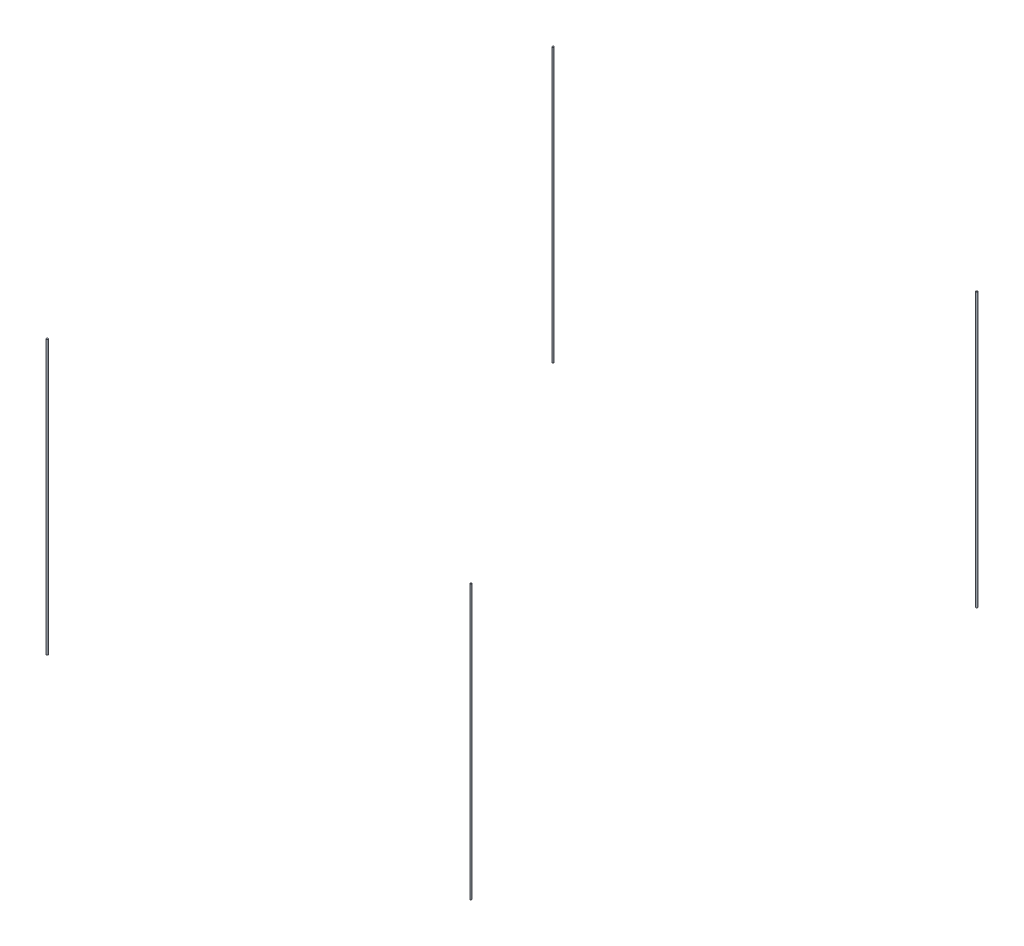
ISO-10303-21;
HEADER;
FILE_DESCRIPTION(('STEP AP214'),'2;1');
FILE_NAME('part.step','',(''),(''),'','','');
FILE_SCHEMA(('AUTOMOTIVE_DESIGN { 1 0 10303 214 1 1 1 1 }'));
ENDSEC;
DATA;
#1=APPLICATION_CONTEXT('core data for automotive mechanical design processes');
#2=APPLICATION_PROTOCOL_DEFINITION('international standard','automotive_design',2000,#1);
#3=PRODUCT_CONTEXT('',#1,'mechanical');
#4=PRODUCT('Part','Part','',(#3));
#5=PRODUCT_RELATED_PRODUCT_CATEGORY('part','',(#4));
#6=PRODUCT_DEFINITION_FORMATION('','',#4);
#7=PRODUCT_DEFINITION_CONTEXT('part definition',#1,'design');
#8=PRODUCT_DEFINITION('design','',#6,#7);
#9=PRODUCT_DEFINITION_SHAPE('','',#8);
#10=(LENGTH_UNIT() NAMED_UNIT(*) SI_UNIT(.MILLI.,.METRE.));
#11=(NAMED_UNIT(*) PLANE_ANGLE_UNIT() SI_UNIT($,.RADIAN.));
#12=(NAMED_UNIT(*) SI_UNIT($,.STERADIAN.) SOLID_ANGLE_UNIT());
#13=UNCERTAINTY_MEASURE_WITH_UNIT(LENGTH_MEASURE(1.E-05),#10,'distance_accuracy_value','');
#14=(GEOMETRIC_REPRESENTATION_CONTEXT(3) GLOBAL_UNCERTAINTY_ASSIGNED_CONTEXT((#13)) GLOBAL_UNIT_ASSIGNED_CONTEXT((#10,
#11,#12)) REPRESENTATION_CONTEXT('',''));
#15=CARTESIAN_POINT('',(0.,0.,0.));
#16=DIRECTION('',(0.,0.,1.));
#17=DIRECTION('',(1.,0.,0.));
#18=AXIS2_PLACEMENT_3D('',#15,#16,#17);
#19=CARTESIAN_POINT('',(-3100.,2000.,0.));
#20=DIRECTION('',(0.,-1.,0.));
#21=DIRECTION('',(0.,0.,-1.));
#22=AXIS2_PLACEMENT_3D('',#19,#20,#21);
#23=CYLINDRICAL_SURFACE('',#22,6.00000000000029);
#24=CARTESIAN_POINT('',(-3100.,2000.,0.));
#25=DIRECTION('',(0.,1.,0.));
#26=DIRECTION('',(0.,0.,1.));
#27=AXIS2_PLACEMENT_3D('',#24,#25,#26);
#28=CIRCLE('',#27,6.00000000000029);
#29=CARTESIAN_POINT('',(-3100.,2000.,6.00000000000029));
#30=VERTEX_POINT('',#29);
#31=EDGE_CURVE('E48',#30,#30,#28,.T.);
#32=ORIENTED_EDGE('',*,*,#31,.F.);
#33=EDGE_LOOP('',(#32));
#34=FACE_BOUND('',#33,.T.);
#35=CARTESIAN_POINT('',(-3100.,0.,0.));
#36=DIRECTION('',(0.,1.,0.));
#37=DIRECTION('',(0.,0.,1.));
#38=AXIS2_PLACEMENT_3D('',#35,#36,#37);
#39=CIRCLE('',#38,6.00000000000029);
#40=CARTESIAN_POINT('',(-3100.,0.,6.00000000000029));
#41=VERTEX_POINT('',#40);
#42=EDGE_CURVE('E11',#41,#41,#39,.T.);
#43=ORIENTED_EDGE('',*,*,#42,.T.);
#44=EDGE_LOOP('',(#43));
#45=FACE_BOUND('',#44,.T.);
#46=ADVANCED_FACE('F44',(#34,#45),#23,.T.);
#47=CARTESIAN_POINT('',(-3100.,2000.,0.));
#48=DIRECTION('',(0.,1.,0.));
#49=DIRECTION('',(0.,0.,1.));
#50=AXIS2_PLACEMENT_3D('',#47,#48,#49);
#51=PLANE('',#50);
#52=ORIENTED_EDGE('',*,*,#31,.T.);
#53=EDGE_LOOP('',(#52));
#54=FACE_BOUND('',#53,.T.);
#55=ADVANCED_FACE('F46',(#54),#51,.T.);
#56=CARTESIAN_POINT('',(-3100.,0.,0.));
#57=DIRECTION('',(0.,1.,0.));
#58=DIRECTION('',(0.,0.,1.));
#59=AXIS2_PLACEMENT_3D('',#56,#57,#58);
#60=PLANE('',#59);
#61=ORIENTED_EDGE('',*,*,#42,.F.);
#62=EDGE_LOOP('',(#61));
#63=FACE_BOUND('',#62,.T.);
#64=ADVANCED_FACE('F63',(#63),#60,.F.);
#65=CLOSED_SHELL('',(#46,#55,#64));
#66=MANIFOLD_SOLID_BREP('B2',#65);
#67=CARTESIAN_POINT('',(0.,2000.,0.));
#68=DIRECTION('',(0.,-1.,0.));
#69=DIRECTION('',(0.,0.,-1.));
#70=AXIS2_PLACEMENT_3D('',#67,#68,#69);
#71=CYLINDRICAL_SURFACE('',#70,5.99999999999999);
#72=CARTESIAN_POINT('',(0.,2000.,0.));
#73=DIRECTION('',(0.,1.,0.));
#74=DIRECTION('',(0.,0.,1.));
#75=AXIS2_PLACEMENT_3D('',#72,#73,#74);
#76=CIRCLE('',#75,5.99999999999999);
#77=CARTESIAN_POINT('',(0.,2000.,5.99999999999999));
#78=VERTEX_POINT('',#77);
#79=EDGE_CURVE('E103',#78,#78,#76,.T.);
#80=ORIENTED_EDGE('',*,*,#79,.F.);
#81=EDGE_LOOP('',(#80));
#82=FACE_BOUND('',#81,.T.);
#83=CARTESIAN_POINT('',(0.,0.,0.));
#84=DIRECTION('',(0.,1.,0.));
#85=DIRECTION('',(0.,0.,1.));
#86=AXIS2_PLACEMENT_3D('',#83,#84,#85);
#87=CIRCLE('',#86,5.99999999999999);
#88=CARTESIAN_POINT('',(0.,0.,5.99999999999999));
#89=VERTEX_POINT('',#88);
#90=EDGE_CURVE('E43',#89,#89,#87,.T.);
#91=ORIENTED_EDGE('',*,*,#90,.T.);
#92=EDGE_LOOP('',(#91));
#93=FACE_BOUND('',#92,.T.);
#94=ADVANCED_FACE('F99',(#82,#93),#71,.T.);
#95=CARTESIAN_POINT('',(0.,2000.,0.));
#96=DIRECTION('',(0.,1.,0.));
#97=DIRECTION('',(0.,0.,1.));
#98=AXIS2_PLACEMENT_3D('',#95,#96,#97);
#99=PLANE('',#98);
#100=ORIENTED_EDGE('',*,*,#79,.T.);
#101=EDGE_LOOP('',(#100));
#102=FACE_BOUND('',#101,.T.);
#103=ADVANCED_FACE('F101',(#102),#99,.T.);
#104=CARTESIAN_POINT('',(0.,0.,0.));
#105=DIRECTION('',(0.,1.,0.));
#106=DIRECTION('',(0.,0.,1.));
#107=AXIS2_PLACEMENT_3D('',#104,#105,#106);
#108=PLANE('',#107);
#109=ORIENTED_EDGE('',*,*,#90,.F.);
#110=EDGE_LOOP('',(#109));
#111=FACE_BOUND('',#110,.T.);
#112=ADVANCED_FACE('F118',(#111),#108,.F.);
#113=CLOSED_SHELL('',(#94,#103,#112));
#114=MANIFOLD_SOLID_BREP('B6',#113);
#115=CARTESIAN_POINT('',(0.,2000.,-3700.));
#116=DIRECTION('',(0.,-1.,0.));
#117=DIRECTION('',(0.,0.,-1.));
#118=AXIS2_PLACEMENT_3D('',#115,#116,#117);
#119=CYLINDRICAL_SURFACE('',#118,6.00000000000013);
#120=CARTESIAN_POINT('',(0.,2000.,-3700.));
#121=DIRECTION('',(0.,1.,0.));
#122=DIRECTION('',(0.,0.,1.));
#123=AXIS2_PLACEMENT_3D('',#120,#121,#122);
#124=CIRCLE('',#123,6.00000000000013);
#125=CARTESIAN_POINT('',(0.,2000.,-3694.));
#126=VERTEX_POINT('',#125);
#127=EDGE_CURVE('E157',#126,#126,#124,.T.);
#128=ORIENTED_EDGE('',*,*,#127,.F.);
#129=EDGE_LOOP('',(#128));
#130=FACE_BOUND('',#129,.T.);
#131=CARTESIAN_POINT('',(0.,0.,-3700.));
#132=DIRECTION('',(0.,1.,0.));
#133=DIRECTION('',(0.,0.,1.));
#134=AXIS2_PLACEMENT_3D('',#131,#132,#133);
#135=CIRCLE('',#134,6.00000000000013);
#136=CARTESIAN_POINT('',(0.,0.,-3694.));
#137=VERTEX_POINT('',#136);
#138=EDGE_CURVE('E98',#137,#137,#135,.T.);
#139=ORIENTED_EDGE('',*,*,#138,.T.);
#140=EDGE_LOOP('',(#139));
#141=FACE_BOUND('',#140,.T.);
#142=ADVANCED_FACE('F153',(#130,#141),#119,.T.);
#143=CARTESIAN_POINT('',(0.,2000.,-3700.));
#144=DIRECTION('',(0.,1.,0.));
#145=DIRECTION('',(0.,0.,1.));
#146=AXIS2_PLACEMENT_3D('',#143,#144,#145);
#147=PLANE('',#146);
#148=ORIENTED_EDGE('',*,*,#127,.T.);
#149=EDGE_LOOP('',(#148));
#150=FACE_BOUND('',#149,.T.);
#151=ADVANCED_FACE('F155',(#150),#147,.T.);
#152=CARTESIAN_POINT('',(0.,0.,-3700.));
#153=DIRECTION('',(0.,1.,0.));
#154=DIRECTION('',(0.,0.,1.));
#155=AXIS2_PLACEMENT_3D('',#152,#153,#154);
#156=PLANE('',#155);
#157=ORIENTED_EDGE('',*,*,#138,.F.);
#158=EDGE_LOOP('',(#157));
#159=FACE_BOUND('',#158,.T.);
#160=ADVANCED_FACE('F172',(#159),#156,.F.);
#161=CLOSED_SHELL('',(#142,#151,#160));
#162=MANIFOLD_SOLID_BREP('B38',#161);
#163=CARTESIAN_POINT('',(-3100.,2000.,-3700.));
#164=DIRECTION('',(0.,-1.,0.));
#165=DIRECTION('',(0.,0.,-1.));
#166=AXIS2_PLACEMENT_3D('',#163,#164,#165);
#167=CYLINDRICAL_SURFACE('',#166,5.99999999999933);
#168=CARTESIAN_POINT('',(-3100.,2000.,-3700.));
#169=DIRECTION('',(0.,1.,0.));
#170=DIRECTION('',(0.,0.,1.));
#171=AXIS2_PLACEMENT_3D('',#168,#169,#170);
#172=CIRCLE('',#171,5.99999999999933);
#173=CARTESIAN_POINT('',(-3100.,2000.,-3694.));
#174=VERTEX_POINT('',#173);
#175=EDGE_CURVE('E152',#174,#174,#172,.T.);
#176=ORIENTED_EDGE('',*,*,#175,.F.);
#177=EDGE_LOOP('',(#176));
#178=FACE_BOUND('',#177,.T.);
#179=CARTESIAN_POINT('',(-3100.,0.,-3700.));
#180=DIRECTION('',(0.,1.,0.));
#181=DIRECTION('',(0.,0.,1.));
#182=AXIS2_PLACEMENT_3D('',#179,#180,#181);
#183=CIRCLE('',#182,5.99999999999933);
#184=CARTESIAN_POINT('',(-3100.,0.,-3694.));
#185=VERTEX_POINT('',#184);
#186=EDGE_CURVE('E203',#185,#185,#183,.T.);
#187=ORIENTED_EDGE('',*,*,#186,.T.);
#188=EDGE_LOOP('',(#187));
#189=FACE_BOUND('',#188,.T.);
#190=ADVANCED_FACE('F200',(#178,#189),#167,.T.);
#191=CARTESIAN_POINT('',(-3100.,2000.,-3700.));
#192=DIRECTION('',(0.,1.,0.));
#193=DIRECTION('',(0.,0.,1.));
#194=AXIS2_PLACEMENT_3D('',#191,#192,#193);
#195=PLANE('',#194);
#196=ORIENTED_EDGE('',*,*,#175,.T.);
#197=EDGE_LOOP('',(#196));
#198=FACE_BOUND('',#197,.T.);
#199=ADVANCED_FACE('F215',(#198),#195,.T.);
#200=CARTESIAN_POINT('',(-3100.,0.,-3700.));
#201=DIRECTION('',(0.,1.,0.));
#202=DIRECTION('',(0.,0.,1.));
#203=AXIS2_PLACEMENT_3D('',#200,#201,#202);
#204=PLANE('',#203);
#205=ORIENTED_EDGE('',*,*,#186,.F.);
#206=EDGE_LOOP('',(#205));
#207=FACE_BOUND('',#206,.T.);
#208=ADVANCED_FACE('F213',(#207),#204,.F.);
#209=CLOSED_SHELL('',(#190,#199,#208));
#210=MANIFOLD_SOLID_BREP('B93',#209);
#211=ADVANCED_BREP_SHAPE_REPRESENTATION('',(#18,#66,#114,#162,#210),#14);
#212=SHAPE_DEFINITION_REPRESENTATION(#9,#211);
ENDSEC;
END-ISO-10303-21;
